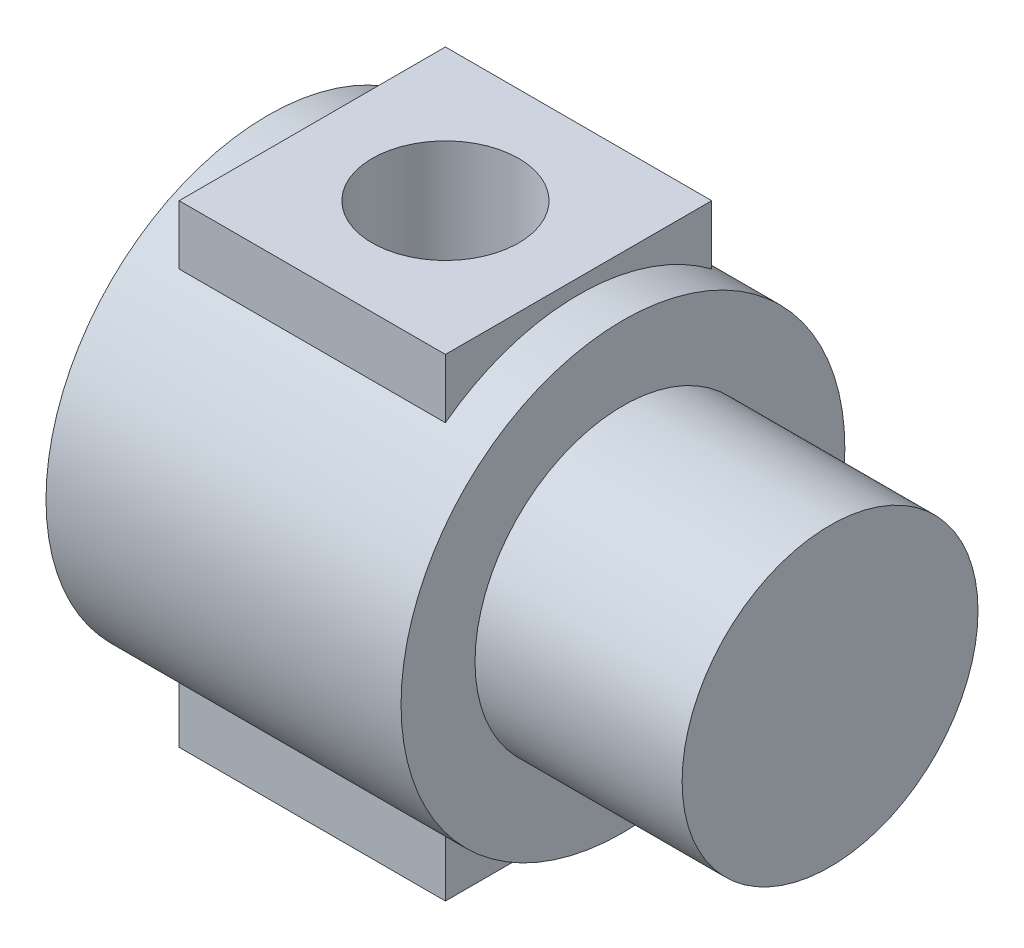
ISO-10303-21;
HEADER;
FILE_DESCRIPTION(('STEP AP214'),'2;1');
FILE_NAME('part.step','',(''),(''),'','','');
FILE_SCHEMA(('AUTOMOTIVE_DESIGN { 1 0 10303 214 1 1 1 1 }'));
ENDSEC;
DATA;
#1=APPLICATION_CONTEXT('core data for automotive mechanical design processes');
#2=APPLICATION_PROTOCOL_DEFINITION('international standard','automotive_design',2000,#1);
#3=PRODUCT_CONTEXT('',#1,'mechanical');
#4=PRODUCT('Part','Part','',(#3));
#5=PRODUCT_RELATED_PRODUCT_CATEGORY('part','',(#4));
#6=PRODUCT_DEFINITION_FORMATION('','',#4);
#7=PRODUCT_DEFINITION_CONTEXT('part definition',#1,'design');
#8=PRODUCT_DEFINITION('design','',#6,#7);
#9=PRODUCT_DEFINITION_SHAPE('','',#8);
#10=(LENGTH_UNIT() NAMED_UNIT(*) SI_UNIT(.MILLI.,.METRE.));
#11=(NAMED_UNIT(*) PLANE_ANGLE_UNIT() SI_UNIT($,.RADIAN.));
#12=(NAMED_UNIT(*) SI_UNIT($,.STERADIAN.) SOLID_ANGLE_UNIT());
#13=UNCERTAINTY_MEASURE_WITH_UNIT(LENGTH_MEASURE(1.E-05),#10,'distance_accuracy_value','');
#14=(GEOMETRIC_REPRESENTATION_CONTEXT(3) GLOBAL_UNCERTAINTY_ASSIGNED_CONTEXT((#13)) GLOBAL_UNIT_ASSIGNED_CONTEXT((#10,
#11,#12)) REPRESENTATION_CONTEXT('',''));
#15=CARTESIAN_POINT('',(0.,0.,0.));
#16=DIRECTION('',(0.,0.,1.));
#17=DIRECTION('',(1.,0.,0.));
#18=AXIS2_PLACEMENT_3D('',#15,#16,#17);
#19=CARTESIAN_POINT('',(-13.5,4.953,0.));
#20=DIRECTION('',(-1.,0.,0.));
#21=DIRECTION('',(0.,0.,1.));
#22=AXIS2_PLACEMENT_3D('',#19,#20,#21);
#23=PLANE('',#22);
#24=CARTESIAN_POINT('',(-13.5,0.,0.));
#25=DIRECTION('',(-1.,0.,0.));
#26=DIRECTION('',(0.,0.,1.));
#27=AXIS2_PLACEMENT_3D('',#24,#25,#26);
#28=CIRCLE('',#27,4.953);
#29=CARTESIAN_POINT('',(-13.5,4.77307123349315,-1.32287565553234));
#30=VERTEX_POINT('',#29);
#31=CARTESIAN_POINT('',(-13.5,-4.77307123349315,-1.32287565553234));
#32=VERTEX_POINT('',#31);
#33=EDGE_CURVE('E137',#30,#32,#28,.T.);
#34=ORIENTED_EDGE('',*,*,#33,.T.);
#35=DIRECTION('',(0.,-1.,0.));
#36=VECTOR('',#35,1.);
#37=CARTESIAN_POINT('',(-13.5,-60.,-1.3228756555323));
#38=LINE('',#37,#36);
#39=EDGE_CURVE('E11',#30,#32,#38,.T.);
#40=ORIENTED_EDGE('',*,*,#39,.F.);
#41=EDGE_LOOP('',(#34,#40));
#42=FACE_BOUND('',#41,.T.);
#43=ADVANCED_FACE('F41',(#42),#23,.T.);
#44=CARTESIAN_POINT('',(14.,0.,0.));
#45=DIRECTION('',(-1.,0.,0.));
#46=DIRECTION('',(0.,0.,1.));
#47=AXIS2_PLACEMENT_3D('',#44,#45,#46);
#48=PLANE('',#47);
#49=CARTESIAN_POINT('',(14.,0.,0.));
#50=DIRECTION('',(-1.,0.,0.));
#51=DIRECTION('',(0.,0.,1.));
#52=AXIS2_PLACEMENT_3D('',#49,#50,#51);
#53=CIRCLE('',#52,10.);
#54=CARTESIAN_POINT('',(14.,0.,10.));
#55=VERTEX_POINT('',#54);
#56=EDGE_CURVE('E192',#55,#55,#53,.T.);
#57=ORIENTED_EDGE('',*,*,#56,.F.);
#58=EDGE_LOOP('',(#57));
#59=FACE_BOUND('',#58,.T.);
#60=ADVANCED_FACE('F43',(#59),#48,.F.);
#61=CARTESIAN_POINT('',(-1000.,0.,0.));
#62=DIRECTION('',(-1.,0.,0.));
#63=DIRECTION('',(0.,0.,1.));
#64=AXIS2_PLACEMENT_3D('',#61,#62,#63);
#65=CYLINDRICAL_SURFACE('',#64,10.);
#66=CARTESIAN_POINT('',(0.,0.,0.));
#67=DIRECTION('',(-1.,0.,0.));
#68=DIRECTION('',(0.,0.,1.));
#69=AXIS2_PLACEMENT_3D('',#66,#67,#68);
#70=CIRCLE('',#69,10.);
#71=CARTESIAN_POINT('',(0.,0.,10.));
#72=VERTEX_POINT('',#71);
#73=EDGE_CURVE('E191',#72,#72,#70,.T.);
#74=ORIENTED_EDGE('',*,*,#73,.F.);
#75=EDGE_LOOP('',(#74));
#76=FACE_BOUND('',#75,.T.);
#77=ORIENTED_EDGE('',*,*,#56,.T.);
#78=EDGE_LOOP('',(#77));
#79=FACE_BOUND('',#78,.T.);
#80=ADVANCED_FACE('F232',(#76,#79),#65,.T.);
#81=CARTESIAN_POINT('',(0.,10.,0.));
#82=DIRECTION('',(-1.,0.,0.));
#83=DIRECTION('',(0.,0.,1.));
#84=AXIS2_PLACEMENT_3D('',#81,#82,#83);
#85=PLANE('',#84);
#86=CARTESIAN_POINT('',(0.,0.,0.));
#87=DIRECTION('',(-1.,0.,0.));
#88=DIRECTION('',(0.,0.,1.));
#89=AXIS2_PLACEMENT_3D('',#86,#87,#88);
#90=CIRCLE('',#89,15.);
#91=CARTESIAN_POINT('',(0.,0.,15.));
#92=VERTEX_POINT('',#91);
#93=EDGE_CURVE('E186',#92,#92,#90,.T.);
#94=ORIENTED_EDGE('',*,*,#93,.F.);
#95=EDGE_LOOP('',(#94));
#96=FACE_BOUND('',#95,.T.);
#97=ORIENTED_EDGE('',*,*,#73,.T.);
#98=EDGE_LOOP('',(#97));
#99=FACE_BOUND('',#98,.T.);
#100=ADVANCED_FACE('F230',(#96,#99),#85,.F.);
#101=CARTESIAN_POINT('',(-1000.,0.,0.));
#102=DIRECTION('',(-1.,0.,0.));
#103=DIRECTION('',(0.,0.,1.));
#104=AXIS2_PLACEMENT_3D('',#101,#102,#103);
#105=CYLINDRICAL_SURFACE('',#104,15.);
#106=CARTESIAN_POINT('',(-21.,0.,0.));
#107=DIRECTION('',(1.,0.,0.));
#108=DIRECTION('',(0.,0.,-1.));
#109=AXIS2_PLACEMENT_3D('',#106,#107,#108);
#110=CIRCLE('',#109,15.);
#111=CARTESIAN_POINT('',(-21.,-12.,9.));
#112=VERTEX_POINT('',#111);
#113=CARTESIAN_POINT('',(-21.,-12.,-9.));
#114=VERTEX_POINT('',#113);
#115=EDGE_CURVE('E60',#112,#114,#110,.T.);
#116=ORIENTED_EDGE('',*,*,#115,.F.);
#117=DIRECTION('',(-1.,0.,0.));
#118=VECTOR('',#117,1.);
#119=CARTESIAN_POINT('',(-1000.,-12.,9.));
#120=LINE('',#119,#118);
#121=CARTESIAN_POINT('',(-3.,-12.,9.));
#122=VERTEX_POINT('',#121);
#123=EDGE_CURVE('E64',#112,#122,#120,.F.);
#124=ORIENTED_EDGE('',*,*,#123,.T.);
#125=CARTESIAN_POINT('',(-3.,0.,0.));
#126=DIRECTION('',(-1.,0.,0.));
#127=DIRECTION('',(0.,0.,1.));
#128=AXIS2_PLACEMENT_3D('',#125,#126,#127);
#129=CIRCLE('',#128,15.);
#130=CARTESIAN_POINT('',(-3.,-12.,-9.));
#131=VERTEX_POINT('',#130);
#132=EDGE_CURVE('E211',#131,#122,#129,.T.);
#133=ORIENTED_EDGE('',*,*,#132,.F.);
#134=DIRECTION('',(-1.,0.,0.));
#135=VECTOR('',#134,1.);
#136=CARTESIAN_POINT('',(-1000.,-12.,-9.));
#137=LINE('',#136,#135);
#138=EDGE_CURVE('E209',#114,#131,#137,.F.);
#139=ORIENTED_EDGE('',*,*,#138,.F.);
#140=EDGE_LOOP('',(#116,#124,#133,#139));
#141=FACE_BOUND('',#140,.T.);
#142=CARTESIAN_POINT('',(-3.,0.,0.));
#143=DIRECTION('',(-1.,0.,0.));
#144=DIRECTION('',(0.,0.,1.));
#145=AXIS2_PLACEMENT_3D('',#142,#143,#144);
#146=CIRCLE('',#145,15.);
#147=CARTESIAN_POINT('',(-3.,12.,9.));
#148=VERTEX_POINT('',#147);
#149=CARTESIAN_POINT('',(-3.,12.,-9.));
#150=VERTEX_POINT('',#149);
#151=EDGE_CURVE('E202',#148,#150,#146,.T.);
#152=ORIENTED_EDGE('',*,*,#151,.F.);
#153=DIRECTION('',(-1.,0.,0.));
#154=VECTOR('',#153,1.);
#155=CARTESIAN_POINT('',(-1000.,12.,9.));
#156=LINE('',#155,#154);
#157=CARTESIAN_POINT('',(-21.,12.,9.));
#158=VERTEX_POINT('',#157);
#159=EDGE_CURVE('E210',#148,#158,#156,.T.);
#160=ORIENTED_EDGE('',*,*,#159,.T.);
#161=CARTESIAN_POINT('',(-21.,0.,0.));
#162=DIRECTION('',(1.,0.,0.));
#163=DIRECTION('',(0.,0.,-1.));
#164=AXIS2_PLACEMENT_3D('',#161,#162,#163);
#165=CIRCLE('',#164,15.);
#166=CARTESIAN_POINT('',(-21.,12.,-9.));
#167=VERTEX_POINT('',#166);
#168=EDGE_CURVE('E204',#167,#158,#165,.T.);
#169=ORIENTED_EDGE('',*,*,#168,.F.);
#170=DIRECTION('',(-1.,0.,0.));
#171=VECTOR('',#170,1.);
#172=CARTESIAN_POINT('',(-1000.,12.,-9.));
#173=LINE('',#172,#171);
#174=EDGE_CURVE('E197',#150,#167,#173,.T.);
#175=ORIENTED_EDGE('',*,*,#174,.F.);
#176=EDGE_LOOP('',(#152,#160,#169,#175));
#177=FACE_BOUND('',#176,.T.);
#178=CARTESIAN_POINT('',(-24.,0.,0.));
#179=DIRECTION('',(-1.,0.,0.));
#180=DIRECTION('',(0.,0.,1.));
#181=AXIS2_PLACEMENT_3D('',#178,#179,#180);
#182=CIRCLE('',#181,15.);
#183=CARTESIAN_POINT('',(-24.,0.,15.));
#184=VERTEX_POINT('',#183);
#185=EDGE_CURVE('E187',#184,#184,#182,.T.);
#186=ORIENTED_EDGE('',*,*,#185,.F.);
#187=EDGE_LOOP('',(#186));
#188=FACE_BOUND('',#187,.T.);
#189=ORIENTED_EDGE('',*,*,#93,.T.);
#190=EDGE_LOOP('',(#189));
#191=FACE_BOUND('',#190,.T.);
#192=ADVANCED_FACE('F223',(#141,#177,#188,#191),#105,.T.);
#193=CARTESIAN_POINT('',(-24.,15.,0.));
#194=DIRECTION('',(1.,0.,0.));
#195=DIRECTION('',(0.,0.,-1.));
#196=AXIS2_PLACEMENT_3D('',#193,#194,#195);
#197=PLANE('',#196);
#198=CARTESIAN_POINT('',(-24.,0.,0.));
#199=DIRECTION('',(1.,0.,0.));
#200=DIRECTION('',(0.,0.,-1.));
#201=AXIS2_PLACEMENT_3D('',#198,#199,#200);
#202=CIRCLE('',#201,4.953);
#203=CARTESIAN_POINT('',(-24.,0.,-4.953));
#204=VERTEX_POINT('',#203);
#205=EDGE_CURVE('E139',#204,#204,#202,.F.);
#206=ORIENTED_EDGE('',*,*,#205,.F.);
#207=EDGE_LOOP('',(#206));
#208=FACE_BOUND('',#207,.T.);
#209=ORIENTED_EDGE('',*,*,#185,.T.);
#210=EDGE_LOOP('',(#209));
#211=FACE_BOUND('',#210,.T.);
#212=ADVANCED_FACE('F220',(#208,#211),#197,.F.);
#213=CARTESIAN_POINT('',(0.,0.,9.));
#214=DIRECTION('',(0.,0.,1.));
#215=DIRECTION('',(1.,0.,0.));
#216=AXIS2_PLACEMENT_3D('',#213,#214,#215);
#217=PLANE('',#216);
#218=ORIENTED_EDGE('',*,*,#159,.F.);
#219=DIRECTION('',(0.,1.,0.));
#220=VECTOR('',#219,1.);
#221=CARTESIAN_POINT('',(-3.,0.,9.));
#222=LINE('',#221,#220);
#223=CARTESIAN_POINT('',(-3.,16.,9.));
#224=VERTEX_POINT('',#223);
#225=EDGE_CURVE('E167',#148,#224,#222,.T.);
#226=ORIENTED_EDGE('',*,*,#225,.T.);
#227=DIRECTION('',(-1.,0.,0.));
#228=VECTOR('',#227,1.);
#229=CARTESIAN_POINT('',(-3.,16.,9.));
#230=LINE('',#229,#228);
#231=CARTESIAN_POINT('',(-21.,16.,9.));
#232=VERTEX_POINT('',#231);
#233=EDGE_CURVE('E173',#224,#232,#230,.T.);
#234=ORIENTED_EDGE('',*,*,#233,.T.);
#235=DIRECTION('',(0.,-1.,0.));
#236=VECTOR('',#235,1.);
#237=CARTESIAN_POINT('',(-21.,16.,9.));
#238=LINE('',#237,#236);
#239=EDGE_CURVE('E170',#232,#158,#238,.T.);
#240=ORIENTED_EDGE('',*,*,#239,.T.);
#241=EDGE_LOOP('',(#218,#226,#234,#240));
#242=FACE_BOUND('',#241,.T.);
#243=ADVANCED_FACE('F225',(#242),#217,.T.);
#244=CARTESIAN_POINT('',(0.,0.,-9.));
#245=DIRECTION('',(0.,0.,1.));
#246=DIRECTION('',(1.,0.,0.));
#247=AXIS2_PLACEMENT_3D('',#244,#245,#246);
#248=PLANE('',#247);
#249=DIRECTION('',(0.,1.,0.));
#250=VECTOR('',#249,1.);
#251=CARTESIAN_POINT('',(-3.,0.,-9.));
#252=LINE('',#251,#250);
#253=CARTESIAN_POINT('',(-3.,16.,-9.));
#254=VERTEX_POINT('',#253);
#255=EDGE_CURVE('E178',#150,#254,#252,.T.);
#256=ORIENTED_EDGE('',*,*,#255,.F.);
#257=ORIENTED_EDGE('',*,*,#174,.T.);
#258=DIRECTION('',(0.,-1.,0.));
#259=VECTOR('',#258,1.);
#260=CARTESIAN_POINT('',(-21.,16.,-9.));
#261=LINE('',#260,#259);
#262=CARTESIAN_POINT('',(-21.,16.,-9.));
#263=VERTEX_POINT('',#262);
#264=EDGE_CURVE('E168',#263,#167,#261,.T.);
#265=ORIENTED_EDGE('',*,*,#264,.F.);
#266=DIRECTION('',(-1.,0.,0.));
#267=VECTOR('',#266,1.);
#268=CARTESIAN_POINT('',(-3.,16.,-9.));
#269=LINE('',#268,#267);
#270=EDGE_CURVE('E171',#254,#263,#269,.T.);
#271=ORIENTED_EDGE('',*,*,#270,.F.);
#272=EDGE_LOOP('',(#256,#257,#265,#271));
#273=FACE_BOUND('',#272,.T.);
#274=ADVANCED_FACE('F419',(#273),#248,.F.);
#275=CARTESIAN_POINT('',(-21.,16.,9.));
#276=DIRECTION('',(1.,0.,0.));
#277=DIRECTION('',(0.,0.,-1.));
#278=AXIS2_PLACEMENT_3D('',#275,#276,#277);
#279=PLANE('',#278);
#280=ORIENTED_EDGE('',*,*,#264,.T.);
#281=ORIENTED_EDGE('',*,*,#168,.T.);
#282=ORIENTED_EDGE('',*,*,#239,.F.);
#283=DIRECTION('',(0.,0.,-1.));
#284=VECTOR('',#283,1.);
#285=CARTESIAN_POINT('',(-21.,16.,9.));
#286=LINE('',#285,#284);
#287=EDGE_CURVE('E174',#232,#263,#286,.T.);
#288=ORIENTED_EDGE('',*,*,#287,.T.);
#289=EDGE_LOOP('',(#280,#281,#282,#288));
#290=FACE_BOUND('',#289,.T.);
#291=ADVANCED_FACE('F407',(#290),#279,.F.);
#292=CARTESIAN_POINT('',(-3.,0.,9.));
#293=DIRECTION('',(-1.,0.,0.));
#294=DIRECTION('',(0.,0.,1.));
#295=AXIS2_PLACEMENT_3D('',#292,#293,#294);
#296=PLANE('',#295);
#297=ORIENTED_EDGE('',*,*,#225,.F.);
#298=ORIENTED_EDGE('',*,*,#151,.T.);
#299=ORIENTED_EDGE('',*,*,#255,.T.);
#300=DIRECTION('',(0.,0.,-1.));
#301=VECTOR('',#300,1.);
#302=CARTESIAN_POINT('',(-3.,16.,9.));
#303=LINE('',#302,#301);
#304=EDGE_CURVE('E182',#224,#254,#303,.T.);
#305=ORIENTED_EDGE('',*,*,#304,.F.);
#306=EDGE_LOOP('',(#297,#298,#299,#305));
#307=FACE_BOUND('',#306,.T.);
#308=ADVANCED_FACE('F402',(#307),#296,.F.);
#309=CARTESIAN_POINT('',(-3.,16.,9.));
#310=DIRECTION('',(0.,-1.,0.));
#311=DIRECTION('',(0.,0.,-1.));
#312=AXIS2_PLACEMENT_3D('',#309,#310,#311);
#313=PLANE('',#312);
#314=CARTESIAN_POINT('',(-12.,16.,0.));
#315=DIRECTION('',(0.,-1.,0.));
#316=DIRECTION('',(0.,0.,-1.));
#317=AXIS2_PLACEMENT_3D('',#314,#315,#316);
#318=CIRCLE('',#317,4.953);
#319=CARTESIAN_POINT('',(-12.,16.,-4.953));
#320=VERTEX_POINT('',#319);
#321=EDGE_CURVE('E140',#320,#320,#318,.T.);
#322=ORIENTED_EDGE('',*,*,#321,.T.);
#323=EDGE_LOOP('',(#322));
#324=FACE_BOUND('',#323,.T.);
#325=ORIENTED_EDGE('',*,*,#270,.T.);
#326=ORIENTED_EDGE('',*,*,#287,.F.);
#327=ORIENTED_EDGE('',*,*,#233,.F.);
#328=ORIENTED_EDGE('',*,*,#304,.T.);
#329=EDGE_LOOP('',(#325,#326,#327,#328));
#330=FACE_BOUND('',#329,.T.);
#331=ADVANCED_FACE('F392',(#324,#330),#313,.F.);
#332=CARTESIAN_POINT('',(0.,0.,9.));
#333=DIRECTION('',(0.,0.,1.));
#334=DIRECTION('',(1.,0.,0.));
#335=AXIS2_PLACEMENT_3D('',#332,#333,#334);
#336=PLANE('',#335);
#337=ORIENTED_EDGE('',*,*,#123,.F.);
#338=DIRECTION('',(0.,-1.,0.));
#339=VECTOR('',#338,1.);
#340=CARTESIAN_POINT('',(-21.,0.,9.));
#341=LINE('',#340,#339);
#342=CARTESIAN_POINT('',(-21.,-16.,9.));
#343=VERTEX_POINT('',#342);
#344=EDGE_CURVE('E149',#112,#343,#341,.T.);
#345=ORIENTED_EDGE('',*,*,#344,.T.);
#346=DIRECTION('',(1.,0.,0.));
#347=VECTOR('',#346,1.);
#348=CARTESIAN_POINT('',(-21.,-16.,9.));
#349=LINE('',#348,#347);
#350=CARTESIAN_POINT('',(-3.,-16.,9.));
#351=VERTEX_POINT('',#350);
#352=EDGE_CURVE('E150',#343,#351,#349,.T.);
#353=ORIENTED_EDGE('',*,*,#352,.T.);
#354=DIRECTION('',(0.,1.,0.));
#355=VECTOR('',#354,1.);
#356=CARTESIAN_POINT('',(-3.,-16.,9.));
#357=LINE('',#356,#355);
#358=EDGE_CURVE('E153',#351,#122,#357,.T.);
#359=ORIENTED_EDGE('',*,*,#358,.T.);
#360=EDGE_LOOP('',(#337,#345,#353,#359));
#361=FACE_BOUND('',#360,.T.);
#362=ADVANCED_FACE('F271',(#361),#336,.T.);
#363=CARTESIAN_POINT('',(0.,0.,-9.));
#364=DIRECTION('',(0.,0.,1.));
#365=DIRECTION('',(1.,0.,0.));
#366=AXIS2_PLACEMENT_3D('',#363,#364,#365);
#367=PLANE('',#366);
#368=DIRECTION('',(0.,-1.,0.));
#369=VECTOR('',#368,1.);
#370=CARTESIAN_POINT('',(-21.,0.,-9.));
#371=LINE('',#370,#369);
#372=CARTESIAN_POINT('',(-21.,-16.,-9.));
#373=VERTEX_POINT('',#372);
#374=EDGE_CURVE('E151',#114,#373,#371,.T.);
#375=ORIENTED_EDGE('',*,*,#374,.F.);
#376=ORIENTED_EDGE('',*,*,#138,.T.);
#377=DIRECTION('',(0.,1.,0.));
#378=VECTOR('',#377,1.);
#379=CARTESIAN_POINT('',(-3.,-16.,-9.));
#380=LINE('',#379,#378);
#381=CARTESIAN_POINT('',(-3.,-16.,-9.));
#382=VERTEX_POINT('',#381);
#383=EDGE_CURVE('E148',#382,#131,#380,.T.);
#384=ORIENTED_EDGE('',*,*,#383,.F.);
#385=DIRECTION('',(1.,0.,0.));
#386=VECTOR('',#385,1.);
#387=CARTESIAN_POINT('',(-21.,-16.,-9.));
#388=LINE('',#387,#386);
#389=EDGE_CURVE('E160',#373,#382,#388,.T.);
#390=ORIENTED_EDGE('',*,*,#389,.F.);
#391=EDGE_LOOP('',(#375,#376,#384,#390));
#392=FACE_BOUND('',#391,.T.);
#393=ADVANCED_FACE('F380',(#392),#367,.F.);
#394=CARTESIAN_POINT('',(-21.,0.,9.));
#395=DIRECTION('',(1.,0.,0.));
#396=DIRECTION('',(0.,0.,-1.));
#397=AXIS2_PLACEMENT_3D('',#394,#395,#396);
#398=PLANE('',#397);
#399=ORIENTED_EDGE('',*,*,#344,.F.);
#400=ORIENTED_EDGE('',*,*,#115,.T.);
#401=ORIENTED_EDGE('',*,*,#374,.T.);
#402=DIRECTION('',(0.,0.,-1.));
#403=VECTOR('',#402,1.);
#404=CARTESIAN_POINT('',(-21.,-16.,9.));
#405=LINE('',#404,#403);
#406=EDGE_CURVE('E161',#343,#373,#405,.T.);
#407=ORIENTED_EDGE('',*,*,#406,.F.);
#408=EDGE_LOOP('',(#399,#400,#401,#407));
#409=FACE_BOUND('',#408,.T.);
#410=ADVANCED_FACE('F367',(#409),#398,.F.);
#411=CARTESIAN_POINT('',(-21.,-16.,9.));
#412=DIRECTION('',(0.,1.,0.));
#413=DIRECTION('',(0.,0.,1.));
#414=AXIS2_PLACEMENT_3D('',#411,#412,#413);
#415=PLANE('',#414);
#416=CARTESIAN_POINT('',(-12.,-16.,0.));
#417=DIRECTION('',(0.,1.,0.));
#418=DIRECTION('',(0.,0.,1.));
#419=AXIS2_PLACEMENT_3D('',#416,#417,#418);
#420=CIRCLE('',#419,4.953);
#421=CARTESIAN_POINT('',(-12.,-16.,4.953));
#422=VERTEX_POINT('',#421);
#423=EDGE_CURVE('E44',#422,#422,#420,.T.);
#424=ORIENTED_EDGE('',*,*,#423,.T.);
#425=EDGE_LOOP('',(#424));
#426=FACE_BOUND('',#425,.T.);
#427=ORIENTED_EDGE('',*,*,#389,.T.);
#428=DIRECTION('',(0.,0.,-1.));
#429=VECTOR('',#428,1.);
#430=CARTESIAN_POINT('',(-3.,-16.,9.));
#431=LINE('',#430,#429);
#432=EDGE_CURVE('E155',#351,#382,#431,.T.);
#433=ORIENTED_EDGE('',*,*,#432,.F.);
#434=ORIENTED_EDGE('',*,*,#352,.F.);
#435=ORIENTED_EDGE('',*,*,#406,.T.);
#436=EDGE_LOOP('',(#427,#433,#434,#435));
#437=FACE_BOUND('',#436,.T.);
#438=ADVANCED_FACE('F268',(#426,#437),#415,.F.);
#439=CARTESIAN_POINT('',(-3.,-16.,9.));
#440=DIRECTION('',(-1.,0.,0.));
#441=DIRECTION('',(0.,0.,1.));
#442=AXIS2_PLACEMENT_3D('',#439,#440,#441);
#443=PLANE('',#442);
#444=ORIENTED_EDGE('',*,*,#383,.T.);
#445=ORIENTED_EDGE('',*,*,#132,.T.);
#446=ORIENTED_EDGE('',*,*,#358,.F.);
#447=ORIENTED_EDGE('',*,*,#432,.T.);
#448=EDGE_LOOP('',(#444,#445,#446,#447));
#449=FACE_BOUND('',#448,.T.);
#450=ADVANCED_FACE('F265',(#449),#443,.F.);
#451=CARTESIAN_POINT('',(-1000.,0.,0.));
#452=DIRECTION('',(-1.,0.,0.));
#453=DIRECTION('',(0.,0.,1.));
#454=AXIS2_PLACEMENT_3D('',#451,#452,#453);
#455=CYLINDRICAL_SURFACE('',#454,4.953);
#456=CARTESIAN_POINT('',(-13.5,-4.77307123349315,-1.32287565553234));
#457=CARTESIAN_POINT('',(-13.5361995825783,-4.78444924919604,-1.28182450224834));
#458=CARTESIAN_POINT('',(-13.5707240949391,-4.79566814652557,-1.2392832234739));
#459=CARTESIAN_POINT('',(-13.636240033161,-4.81752356682732,-1.15140309738031));
#460=CARTESIAN_POINT('',(-13.6672304682038,-4.82815992604614,-1.10606347097721));
#461=CARTESIAN_POINT('',(-13.7546678710956,-4.85881407678904,-0.966043588276946));
#462=CARTESIAN_POINT('',(-13.8054919051766,-4.8775479520278,-0.867463156036224));
#463=CARTESIAN_POINT('',(-13.89043704466,-4.90962358839395,-0.662278422335415));
#464=CARTESIAN_POINT('',(-13.9245200598594,-4.92295304113721,-0.555656453745748));
#465=CARTESIAN_POINT('',(-13.9744377683681,-4.94267963905753,-0.337723607585928));
#466=CARTESIAN_POINT('',(-13.9902999542962,-4.94908722746271,-0.226420057620393));
#467=CARTESIAN_POINT('',(-14.0028330315492,-4.9541418711843,-0.00792349541060047));
#468=CARTESIAN_POINT('',(-14.0003851548334,-4.9531452924983,0.0992116414637586));
#469=CARTESIAN_POINT('',(-13.9784743595748,-4.94433716701627,0.31149137028152));
#470=CARTESIAN_POINT('',(-13.9590031940048,-4.93652231707444,0.416634972187417));
#471=CARTESIAN_POINT('',(-13.9043198339877,-4.91508163391703,0.620060850882443));
#472=CARTESIAN_POINT('',(-13.8693916563371,-4.90156084423413,0.718431498833492));
#473=CARTESIAN_POINT('',(-13.7850523604722,-4.87002024949957,0.907926069866919));
#474=CARTESIAN_POINT('',(-13.7356497570006,-4.85200309040843,0.999054213480991));
#475=CARTESIAN_POINT('',(-13.6527058233184,-4.82317388099437,1.12741091244793));
#476=CARTESIAN_POINT('',(-13.624135421001,-4.81344169179278,1.16818640540193));
#477=CARTESIAN_POINT('',(-13.5641631929688,-4.79353931398934,1.24733672244499));
#478=CARTESIAN_POINT('',(-13.5327678785494,-4.78337015949696,1.28571673858309));
#479=CARTESIAN_POINT('',(-13.5,-4.77307123349316,1.32287565553235));
#480=B_SPLINE_CURVE_WITH_KNOTS('',3,(#456,#457,#458,#459,#460,#461,#462,#463,#464,#465,#466,
#467,#468,#469,#470,#471,#472,#473,#474,#475,#476,#477,#478,#479),.UNSPECIFIED.,.F.,.F.,(4,2,2,
2,2,2,2,2,2,2,2,4),(0.,0.167613716362265,0.335274310179778,0.671003344594564,1.0074927523517,
1.34347377616428,1.66339242380503,1.98346614375577,2.29788818699922,2.61212563806321,
2.7642022026745,2.91593680283728),.UNSPECIFIED.);
#481=CARTESIAN_POINT('',(-13.5,-4.77307123349317,1.3228756555323));
#482=VERTEX_POINT('',#481);
#483=EDGE_CURVE('E124',#32,#482,#480,.T.);
#484=ORIENTED_EDGE('',*,*,#483,.F.);
#485=ORIENTED_EDGE('',*,*,#33,.F.);
#486=CARTESIAN_POINT('',(-13.5,4.77307123349315,1.32287565553234));
#487=CARTESIAN_POINT('',(-13.5361995825783,4.78444924919604,1.28182450224834));
#488=CARTESIAN_POINT('',(-13.5707240949391,4.79566814652557,1.2392832234739));
#489=CARTESIAN_POINT('',(-13.636240033161,4.81752356682732,1.15140309738031));
#490=CARTESIAN_POINT('',(-13.6672304682038,4.82815992604614,1.10606347097721));
#491=CARTESIAN_POINT('',(-13.7546678710956,4.85881407678904,0.966043588276946));
#492=CARTESIAN_POINT('',(-13.8054919051766,4.8775479520278,0.867463156036224));
#493=CARTESIAN_POINT('',(-13.89043704466,4.90962358839395,0.662278422335415));
#494=CARTESIAN_POINT('',(-13.9245200598594,4.92295304113721,0.555656453745748));
#495=CARTESIAN_POINT('',(-13.9744377683681,4.94267963905753,0.337723607585928));
#496=CARTESIAN_POINT('',(-13.9902999542962,4.94908722746271,0.226420057620393));
#497=CARTESIAN_POINT('',(-14.0028330315492,4.9541418711843,0.00792349541060047));
#498=CARTESIAN_POINT('',(-14.0003851548334,4.9531452924983,-0.0992116414637586));
#499=CARTESIAN_POINT('',(-13.9784743595748,4.94433716701627,-0.31149137028152));
#500=CARTESIAN_POINT('',(-13.9590031940048,4.93652231707444,-0.416634972187417));
#501=CARTESIAN_POINT('',(-13.9043198339877,4.91508163391703,-0.620060850882443));
#502=CARTESIAN_POINT('',(-13.8693916563371,4.90156084423413,-0.718431498833492));
#503=CARTESIAN_POINT('',(-13.7850523604722,4.87002024949957,-0.907926069866919));
#504=CARTESIAN_POINT('',(-13.7356497570006,4.85200309040843,-0.999054213480991));
#505=CARTESIAN_POINT('',(-13.6527058233184,4.82317388099437,-1.12741091244793));
#506=CARTESIAN_POINT('',(-13.624135421001,4.81344169179278,-1.16818640540193));
#507=CARTESIAN_POINT('',(-13.5641631929688,4.79353931398934,-1.24733672244499));
#508=CARTESIAN_POINT('',(-13.5327678785494,4.78337015949696,-1.28571673858309));
#509=CARTESIAN_POINT('',(-13.5,4.77307123349316,-1.32287565553235));
#510=B_SPLINE_CURVE_WITH_KNOTS('',3,(#486,#487,#488,#489,#490,#491,#492,#493,#494,#495,#496,
#497,#498,#499,#500,#501,#502,#503,#504,#505,#506,#507,#508,#509),.UNSPECIFIED.,.F.,.F.,(4,2,2,
2,2,2,2,2,2,2,2,4),(0.,0.167613716362265,0.335274310179778,0.671003344594564,1.0074927523517,
1.34347377616428,1.66339242380503,1.98346614375577,2.29788818699922,2.61212563806321,
2.7642022026745,2.91593680283728),.UNSPECIFIED.);
#511=CARTESIAN_POINT('',(-13.5,4.77307123349317,1.3228756555323));
#512=VERTEX_POINT('',#511);
#513=EDGE_CURVE('E131',#512,#30,#510,.T.);
#514=ORIENTED_EDGE('',*,*,#513,.F.);
#515=EDGE_CURVE('E117',#482,#512,#28,.T.);
#516=ORIENTED_EDGE('',*,*,#515,.F.);
#517=EDGE_LOOP('',(#484,#485,#514,#516));
#518=FACE_BOUND('',#517,.T.);
#519=ORIENTED_EDGE('',*,*,#205,.T.);
#520=EDGE_LOOP('',(#519));
#521=FACE_BOUND('',#520,.T.);
#522=ADVANCED_FACE('F132',(#518,#521),#455,.F.);
#523=DIRECTION('',(0.,-1.,0.));
#524=VECTOR('',#523,1.);
#525=CARTESIAN_POINT('',(-13.5,-60.,1.3228756555323));
#526=LINE('',#525,#524);
#527=EDGE_CURVE('E49',#482,#512,#526,.F.);
#528=ORIENTED_EDGE('',*,*,#527,.F.);
#529=ORIENTED_EDGE('',*,*,#515,.T.);
#530=EDGE_LOOP('',(#528,#529));
#531=FACE_BOUND('',#530,.T.);
#532=ADVANCED_FACE('F116',(#531),#23,.T.);
#533=CARTESIAN_POINT('',(-12.,-60.,0.));
#534=DIRECTION('',(0.,-1.,0.));
#535=DIRECTION('',(0.,0.,-1.));
#536=AXIS2_PLACEMENT_3D('',#533,#534,#535);
#537=CYLINDRICAL_SURFACE('',#536,4.953);
#538=CARTESIAN_POINT('',(-12.,5.50000000000001,0.));
#539=DIRECTION('',(0.,-1.,0.));
#540=DIRECTION('',(0.,0.,-1.));
#541=AXIS2_PLACEMENT_3D('',#538,#539,#540);
#542=CIRCLE('',#541,4.953);
#543=CARTESIAN_POINT('',(-12.,5.50000000000001,-4.953));
#544=VERTEX_POINT('',#543);
#545=EDGE_CURVE('E142',#544,#544,#542,.T.);
#546=ORIENTED_EDGE('',*,*,#545,.T.);
#547=EDGE_LOOP('',(#546));
#548=FACE_BOUND('',#547,.T.);
#549=ORIENTED_EDGE('',*,*,#321,.F.);
#550=EDGE_LOOP('',(#549));
#551=FACE_BOUND('',#550,.T.);
#552=ADVANCED_FACE('F259',(#548,#551),#537,.F.);
#553=CARTESIAN_POINT('',(-12.,5.5,0.));
#554=DIRECTION('',(0.,-1.,0.));
#555=DIRECTION('',(0.,0.,-1.));
#556=AXIS2_PLACEMENT_3D('',#553,#554,#555);
#557=PLANE('',#556);
#558=CARTESIAN_POINT('',(-12.,5.50000000000001,0.));
#559=DIRECTION('',(0.,-1.,0.));
#560=DIRECTION('',(0.,0.,-1.));
#561=AXIS2_PLACEMENT_3D('',#558,#559,#560);
#562=CIRCLE('',#561,2.);
#563=CARTESIAN_POINT('',(-12.,5.50000000000001,-2.));
#564=VERTEX_POINT('',#563);
#565=EDGE_CURVE('E301',#564,#564,#562,.T.);
#566=ORIENTED_EDGE('',*,*,#565,.T.);
#567=EDGE_LOOP('',(#566));
#568=FACE_BOUND('',#567,.T.);
#569=ORIENTED_EDGE('',*,*,#545,.F.);
#570=EDGE_LOOP('',(#569));
#571=FACE_BOUND('',#570,.T.);
#572=ADVANCED_FACE('F263',(#568,#571),#557,.F.);
#573=CARTESIAN_POINT('',(-12.,-60.,0.));
#574=DIRECTION('',(0.,-1.,0.));
#575=DIRECTION('',(0.,0.,-1.));
#576=AXIS2_PLACEMENT_3D('',#573,#574,#575);
#577=CYLINDRICAL_SURFACE('',#576,2.);
#578=ORIENTED_EDGE('',*,*,#39,.T.);
#579=ORIENTED_EDGE('',*,*,#483,.T.);
#580=ORIENTED_EDGE('',*,*,#527,.T.);
#581=ORIENTED_EDGE('',*,*,#513,.T.);
#582=EDGE_LOOP('',(#578,#579,#580,#581));
#583=FACE_BOUND('',#582,.T.);
#584=ORIENTED_EDGE('',*,*,#565,.F.);
#585=EDGE_LOOP('',(#584));
#586=FACE_BOUND('',#585,.T.);
#587=CARTESIAN_POINT('',(-12.,-5.5,0.));
#588=DIRECTION('',(0.,-1.,0.));
#589=DIRECTION('',(0.,0.,-1.));
#590=AXIS2_PLACEMENT_3D('',#587,#588,#589);
#591=CIRCLE('',#590,2.);
#592=CARTESIAN_POINT('',(-12.,-5.5,-2.));
#593=VERTEX_POINT('',#592);
#594=EDGE_CURVE('E133',#593,#593,#591,.T.);
#595=ORIENTED_EDGE('',*,*,#594,.T.);
#596=EDGE_LOOP('',(#595));
#597=FACE_BOUND('',#596,.T.);
#598=ADVANCED_FACE('F121',(#583,#586,#597),#577,.F.);
#599=CARTESIAN_POINT('',(-12.,-60.,0.));
#600=DIRECTION('',(0.,-1.,0.));
#601=DIRECTION('',(0.,0.,-1.));
#602=AXIS2_PLACEMENT_3D('',#599,#600,#601);
#603=CYLINDRICAL_SURFACE('',#602,4.953);
#604=CARTESIAN_POINT('',(-12.,-5.5,0.));
#605=DIRECTION('',(0.,-1.,0.));
#606=DIRECTION('',(0.,0.,-1.));
#607=AXIS2_PLACEMENT_3D('',#604,#605,#606);
#608=CIRCLE('',#607,4.953);
#609=CARTESIAN_POINT('',(-12.,-5.5,-4.953));
#610=VERTEX_POINT('',#609);
#611=EDGE_CURVE('E127',#610,#610,#608,.T.);
#612=ORIENTED_EDGE('',*,*,#611,.F.);
#613=EDGE_LOOP('',(#612));
#614=FACE_BOUND('',#613,.T.);
#615=ORIENTED_EDGE('',*,*,#423,.F.);
#616=EDGE_LOOP('',(#615));
#617=FACE_BOUND('',#616,.T.);
#618=ADVANCED_FACE('F286',(#614,#617),#603,.F.);
#619=CARTESIAN_POINT('',(-7.047,-5.5,0.));
#620=DIRECTION('',(0.,1.,0.));
#621=DIRECTION('',(0.,0.,1.));
#622=AXIS2_PLACEMENT_3D('',#619,#620,#621);
#623=PLANE('',#622);
#624=ORIENTED_EDGE('',*,*,#594,.F.);
#625=EDGE_LOOP('',(#624));
#626=FACE_BOUND('',#625,.T.);
#627=ORIENTED_EDGE('',*,*,#611,.T.);
#628=EDGE_LOOP('',(#627));
#629=FACE_BOUND('',#628,.T.);
#630=ADVANCED_FACE('F309',(#626,#629),#623,.F.);
#631=CLOSED_SHELL('',(#43,#60,#80,#100,#192,#212,#243,#274,#291,#308,#331,#362,#393,#410,#438,
#450,#522,#532,#552,#572,#598,#618,#630));
#632=MANIFOLD_SOLID_BREP('B2',#631);
#633=ADVANCED_BREP_SHAPE_REPRESENTATION('',(#18,#632),#14);
#634=SHAPE_DEFINITION_REPRESENTATION(#9,#633);
ENDSEC;
END-ISO-10303-21;
